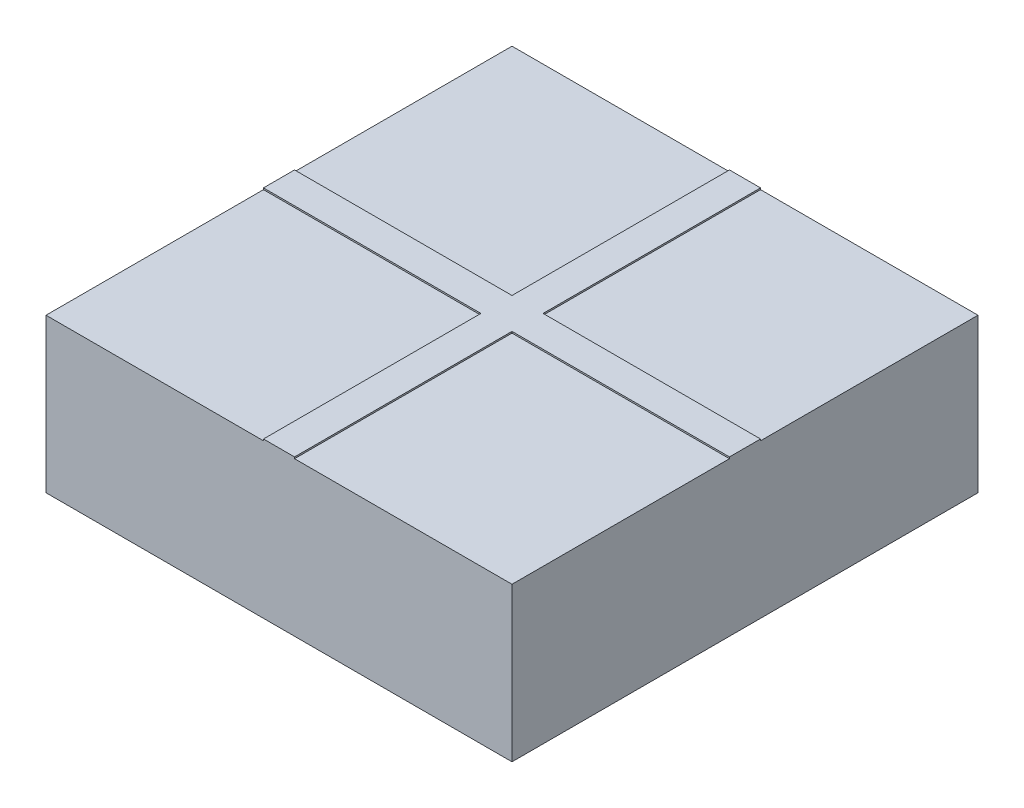
ISO-10303-21;
HEADER;
FILE_DESCRIPTION(('STEP AP214'),'2;1');
FILE_NAME('part.step','',(''),(''),'','','');
FILE_SCHEMA(('AUTOMOTIVE_DESIGN { 1 0 10303 214 1 1 1 1 }'));
ENDSEC;
DATA;
#1=APPLICATION_CONTEXT('core data for automotive mechanical design processes');
#2=APPLICATION_PROTOCOL_DEFINITION('international standard','automotive_design',2000,#1);
#3=PRODUCT_CONTEXT('',#1,'mechanical');
#4=PRODUCT('Part','Part','',(#3));
#5=PRODUCT_RELATED_PRODUCT_CATEGORY('part','',(#4));
#6=PRODUCT_DEFINITION_FORMATION('','',#4);
#7=PRODUCT_DEFINITION_CONTEXT('part definition',#1,'design');
#8=PRODUCT_DEFINITION('design','',#6,#7);
#9=PRODUCT_DEFINITION_SHAPE('','',#8);
#10=(LENGTH_UNIT() NAMED_UNIT(*) SI_UNIT(.MILLI.,.METRE.));
#11=(NAMED_UNIT(*) PLANE_ANGLE_UNIT() SI_UNIT($,.RADIAN.));
#12=(NAMED_UNIT(*) SI_UNIT($,.STERADIAN.) SOLID_ANGLE_UNIT());
#13=UNCERTAINTY_MEASURE_WITH_UNIT(LENGTH_MEASURE(1.E-05),#10,'distance_accuracy_value','');
#14=(GEOMETRIC_REPRESENTATION_CONTEXT(3) GLOBAL_UNCERTAINTY_ASSIGNED_CONTEXT((#13)) GLOBAL_UNIT_ASSIGNED_CONTEXT((#10,
#11,#12)) REPRESENTATION_CONTEXT('',''));
#15=CARTESIAN_POINT('',(0.,0.,0.));
#16=DIRECTION('',(0.,0.,1.));
#17=DIRECTION('',(1.,0.,0.));
#18=AXIS2_PLACEMENT_3D('',#15,#16,#17);
#19=CARTESIAN_POINT('',(150.,90.,150.));
#20=DIRECTION('',(-1.,0.,0.));
#21=DIRECTION('',(0.,0.,1.));
#22=AXIS2_PLACEMENT_3D('',#19,#20,#21);
#23=PLANE('',#22);
#24=DIRECTION('',(0.,-1.,0.));
#25=VECTOR('',#24,1.);
#26=CARTESIAN_POINT('',(150.,90.,-150.));
#27=LINE('',#26,#25);
#28=CARTESIAN_POINT('',(150.,99.,-150.));
#29=VERTEX_POINT('',#28);
#30=CARTESIAN_POINT('',(150.,0.,-150.));
#31=VERTEX_POINT('',#30);
#32=EDGE_CURVE('E12',#29,#31,#27,.T.);
#33=ORIENTED_EDGE('',*,*,#32,.F.);
#34=DIRECTION('',(0.,0.,-1.));
#35=VECTOR('',#34,1.);
#36=CARTESIAN_POINT('',(150.,99.,-10.));
#37=LINE('',#36,#35);
#38=CARTESIAN_POINT('',(150.,99.,-10.));
#39=VERTEX_POINT('',#38);
#40=EDGE_CURVE('E246',#39,#29,#37,.T.);
#41=ORIENTED_EDGE('',*,*,#40,.F.);
#42=DIRECTION('',(0.,-1.,0.));
#43=VECTOR('',#42,1.);
#44=CARTESIAN_POINT('',(150.,100.,-10.));
#45=LINE('',#44,#43);
#46=CARTESIAN_POINT('',(150.,100.,-10.));
#47=VERTEX_POINT('',#46);
#48=EDGE_CURVE('E272',#47,#39,#45,.T.);
#49=ORIENTED_EDGE('',*,*,#48,.F.);
#50=DIRECTION('',(0.,0.,-1.));
#51=VECTOR('',#50,1.);
#52=CARTESIAN_POINT('',(150.,100.,10.));
#53=LINE('',#52,#51);
#54=CARTESIAN_POINT('',(150.,100.,10.));
#55=VERTEX_POINT('',#54);
#56=EDGE_CURVE('E267',#55,#47,#53,.T.);
#57=ORIENTED_EDGE('',*,*,#56,.F.);
#58=DIRECTION('',(0.,-1.,0.));
#59=VECTOR('',#58,1.);
#60=CARTESIAN_POINT('',(150.,100.,10.));
#61=LINE('',#60,#59);
#62=CARTESIAN_POINT('',(150.,99.,10.));
#63=VERTEX_POINT('',#62);
#64=EDGE_CURVE('E236',#55,#63,#61,.T.);
#65=ORIENTED_EDGE('',*,*,#64,.T.);
#66=DIRECTION('',(0.,0.,-1.));
#67=VECTOR('',#66,1.);
#68=CARTESIAN_POINT('',(150.,99.,150.));
#69=LINE('',#68,#67);
#70=CARTESIAN_POINT('',(150.,99.,150.));
#71=VERTEX_POINT('',#70);
#72=EDGE_CURVE('E233',#71,#63,#69,.T.);
#73=ORIENTED_EDGE('',*,*,#72,.F.);
#74=DIRECTION('',(0.,-1.,0.));
#75=VECTOR('',#74,1.);
#76=CARTESIAN_POINT('',(150.,90.,150.));
#77=LINE('',#76,#75);
#78=CARTESIAN_POINT('',(150.,0.,150.));
#79=VERTEX_POINT('',#78);
#80=EDGE_CURVE('E211',#71,#79,#77,.T.);
#81=ORIENTED_EDGE('',*,*,#80,.T.);
#82=DIRECTION('',(0.,0.,-1.));
#83=VECTOR('',#82,1.);
#84=CARTESIAN_POINT('',(150.,0.,150.));
#85=LINE('',#84,#83);
#86=EDGE_CURVE('E202',#79,#31,#85,.T.);
#87=ORIENTED_EDGE('',*,*,#86,.T.);
#88=EDGE_LOOP('',(#33,#41,#49,#57,#65,#73,#81,#87));
#89=FACE_BOUND('',#88,.T.);
#90=ADVANCED_FACE('F61',(#89),#23,.F.);
#91=CARTESIAN_POINT('',(-150.,90.,-150.));
#92=DIRECTION('',(0.,0.,1.));
#93=DIRECTION('',(1.,0.,0.));
#94=AXIS2_PLACEMENT_3D('',#91,#92,#93);
#95=PLANE('',#94);
#96=DIRECTION('',(0.,-1.,0.));
#97=VECTOR('',#96,1.);
#98=CARTESIAN_POINT('',(-150.,90.,-150.));
#99=LINE('',#98,#97);
#100=CARTESIAN_POINT('',(-150.,99.,-150.));
#101=VERTEX_POINT('',#100);
#102=CARTESIAN_POINT('',(-150.,0.,-150.));
#103=VERTEX_POINT('',#102);
#104=EDGE_CURVE('E68',#101,#103,#99,.T.);
#105=ORIENTED_EDGE('',*,*,#104,.F.);
#106=DIRECTION('',(-1.,0.,0.));
#107=VECTOR('',#106,1.);
#108=CARTESIAN_POINT('',(-10.,99.,-150.));
#109=LINE('',#108,#107);
#110=CARTESIAN_POINT('',(-10.,99.,-150.));
#111=VERTEX_POINT('',#110);
#112=EDGE_CURVE('E188',#111,#101,#109,.T.);
#113=ORIENTED_EDGE('',*,*,#112,.F.);
#114=DIRECTION('',(0.,-1.,0.));
#115=VECTOR('',#114,1.);
#116=CARTESIAN_POINT('',(-10.,100.,-150.));
#117=LINE('',#116,#115);
#118=CARTESIAN_POINT('',(-10.,100.,-150.));
#119=VERTEX_POINT('',#118);
#120=EDGE_CURVE('E187',#119,#111,#117,.T.);
#121=ORIENTED_EDGE('',*,*,#120,.F.);
#122=DIRECTION('',(-1.,0.,0.));
#123=VECTOR('',#122,1.);
#124=CARTESIAN_POINT('',(10.,100.,-150.));
#125=LINE('',#124,#123);
#126=CARTESIAN_POINT('',(10.,100.,-150.));
#127=VERTEX_POINT('',#126);
#128=EDGE_CURVE('E276',#127,#119,#125,.T.);
#129=ORIENTED_EDGE('',*,*,#128,.F.);
#130=DIRECTION('',(0.,-1.,0.));
#131=VECTOR('',#130,1.);
#132=CARTESIAN_POINT('',(10.,100.,-150.));
#133=LINE('',#132,#131);
#134=CARTESIAN_POINT('',(10.,99.,-150.));
#135=VERTEX_POINT('',#134);
#136=EDGE_CURVE('E285',#127,#135,#133,.T.);
#137=ORIENTED_EDGE('',*,*,#136,.T.);
#138=DIRECTION('',(-1.,0.,0.));
#139=VECTOR('',#138,1.);
#140=CARTESIAN_POINT('',(150.,99.,-150.));
#141=LINE('',#140,#139);
#142=EDGE_CURVE('E317',#29,#135,#141,.T.);
#143=ORIENTED_EDGE('',*,*,#142,.F.);
#144=ORIENTED_EDGE('',*,*,#32,.T.);
#145=DIRECTION('',(-1.,0.,0.));
#146=VECTOR('',#145,1.);
#147=CARTESIAN_POINT('',(-150.,0.,-150.));
#148=LINE('',#147,#146);
#149=EDGE_CURVE('E205',#31,#103,#148,.T.);
#150=ORIENTED_EDGE('',*,*,#149,.T.);
#151=EDGE_LOOP('',(#105,#113,#121,#129,#137,#143,#144,#150));
#152=FACE_BOUND('',#151,.T.);
#153=ADVANCED_FACE('F318',(#152),#95,.F.);
#154=CARTESIAN_POINT('',(-150.,90.,150.));
#155=DIRECTION('',(1.,0.,0.));
#156=DIRECTION('',(0.,0.,-1.));
#157=AXIS2_PLACEMENT_3D('',#154,#155,#156);
#158=PLANE('',#157);
#159=DIRECTION('',(0.,-1.,0.));
#160=VECTOR('',#159,1.);
#161=CARTESIAN_POINT('',(-150.,90.,150.));
#162=LINE('',#161,#160);
#163=CARTESIAN_POINT('',(-150.,99.,150.));
#164=VERTEX_POINT('',#163);
#165=CARTESIAN_POINT('',(-150.,0.,150.));
#166=VERTEX_POINT('',#165);
#167=EDGE_CURVE('E214',#164,#166,#162,.T.);
#168=ORIENTED_EDGE('',*,*,#167,.F.);
#169=DIRECTION('',(0.,0.,1.));
#170=VECTOR('',#169,1.);
#171=CARTESIAN_POINT('',(-150.,99.,10.));
#172=LINE('',#171,#170);
#173=CARTESIAN_POINT('',(-150.,99.,10.));
#174=VERTEX_POINT('',#173);
#175=EDGE_CURVE('E255',#174,#164,#172,.T.);
#176=ORIENTED_EDGE('',*,*,#175,.F.);
#177=DIRECTION('',(0.,-1.,0.));
#178=VECTOR('',#177,1.);
#179=CARTESIAN_POINT('',(-150.,100.,10.));
#180=LINE('',#179,#178);
#181=CARTESIAN_POINT('',(-150.,100.,10.));
#182=VERTEX_POINT('',#181);
#183=EDGE_CURVE('E304',#182,#174,#180,.T.);
#184=ORIENTED_EDGE('',*,*,#183,.F.);
#185=DIRECTION('',(0.,0.,-1.));
#186=VECTOR('',#185,1.);
#187=CARTESIAN_POINT('',(-150.,100.,10.));
#188=LINE('',#187,#186);
#189=CARTESIAN_POINT('',(-150.,100.,-10.));
#190=VERTEX_POINT('',#189);
#191=EDGE_CURVE('E296',#182,#190,#188,.T.);
#192=ORIENTED_EDGE('',*,*,#191,.T.);
#193=DIRECTION('',(0.,-1.,0.));
#194=VECTOR('',#193,1.);
#195=CARTESIAN_POINT('',(-150.,100.,-10.));
#196=LINE('',#195,#194);
#197=CARTESIAN_POINT('',(-150.,99.,-10.));
#198=VERTEX_POINT('',#197);
#199=EDGE_CURVE('E306',#190,#198,#196,.T.);
#200=ORIENTED_EDGE('',*,*,#199,.T.);
#201=DIRECTION('',(0.,0.,1.));
#202=VECTOR('',#201,1.);
#203=CARTESIAN_POINT('',(-150.,99.,-150.));
#204=LINE('',#203,#202);
#205=EDGE_CURVE('E75',#101,#198,#204,.T.);
#206=ORIENTED_EDGE('',*,*,#205,.F.);
#207=ORIENTED_EDGE('',*,*,#104,.T.);
#208=DIRECTION('',(0.,0.,1.));
#209=VECTOR('',#208,1.);
#210=CARTESIAN_POINT('',(-150.,0.,150.));
#211=LINE('',#210,#209);
#212=EDGE_CURVE('E207',#103,#166,#211,.T.);
#213=ORIENTED_EDGE('',*,*,#212,.T.);
#214=EDGE_LOOP('',(#168,#176,#184,#192,#200,#206,#207,#213));
#215=FACE_BOUND('',#214,.T.);
#216=ADVANCED_FACE('F219',(#215),#158,.F.);
#217=CARTESIAN_POINT('',(-150.,90.,150.));
#218=DIRECTION('',(0.,0.,-1.));
#219=DIRECTION('',(-1.,0.,0.));
#220=AXIS2_PLACEMENT_3D('',#217,#218,#219);
#221=PLANE('',#220);
#222=ORIENTED_EDGE('',*,*,#80,.F.);
#223=DIRECTION('',(1.,0.,0.));
#224=VECTOR('',#223,1.);
#225=CARTESIAN_POINT('',(10.,99.,150.));
#226=LINE('',#225,#224);
#227=CARTESIAN_POINT('',(10.,99.,150.));
#228=VERTEX_POINT('',#227);
#229=EDGE_CURVE('E240',#228,#71,#226,.T.);
#230=ORIENTED_EDGE('',*,*,#229,.F.);
#231=DIRECTION('',(0.,-1.,0.));
#232=VECTOR('',#231,1.);
#233=CARTESIAN_POINT('',(10.,100.,150.));
#234=LINE('',#233,#232);
#235=CARTESIAN_POINT('',(10.,100.,150.));
#236=VERTEX_POINT('',#235);
#237=EDGE_CURVE('E198',#236,#228,#234,.T.);
#238=ORIENTED_EDGE('',*,*,#237,.F.);
#239=DIRECTION('',(-1.,0.,0.));
#240=VECTOR('',#239,1.);
#241=CARTESIAN_POINT('',(10.,100.,150.));
#242=LINE('',#241,#240);
#243=CARTESIAN_POINT('',(-10.,100.,150.));
#244=VERTEX_POINT('',#243);
#245=EDGE_CURVE('E268',#236,#244,#242,.T.);
#246=ORIENTED_EDGE('',*,*,#245,.T.);
#247=DIRECTION('',(0.,-1.,0.));
#248=VECTOR('',#247,1.);
#249=CARTESIAN_POINT('',(-10.,100.,150.));
#250=LINE('',#249,#248);
#251=CARTESIAN_POINT('',(-10.,99.,150.));
#252=VERTEX_POINT('',#251);
#253=EDGE_CURVE('E283',#244,#252,#250,.T.);
#254=ORIENTED_EDGE('',*,*,#253,.T.);
#255=DIRECTION('',(1.,0.,0.));
#256=VECTOR('',#255,1.);
#257=CARTESIAN_POINT('',(-150.,99.,150.));
#258=LINE('',#257,#256);
#259=EDGE_CURVE('E258',#164,#252,#258,.T.);
#260=ORIENTED_EDGE('',*,*,#259,.F.);
#261=ORIENTED_EDGE('',*,*,#167,.T.);
#262=DIRECTION('',(1.,0.,0.));
#263=VECTOR('',#262,1.);
#264=CARTESIAN_POINT('',(-150.,0.,150.));
#265=LINE('',#264,#263);
#266=EDGE_CURVE('E209',#166,#79,#265,.T.);
#267=ORIENTED_EDGE('',*,*,#266,.T.);
#268=EDGE_LOOP('',(#222,#230,#238,#246,#254,#260,#261,#267));
#269=FACE_BOUND('',#268,.T.);
#270=ADVANCED_FACE('F226',(#269),#221,.F.);
#271=CARTESIAN_POINT('',(0.,0.,0.));
#272=DIRECTION('',(0.,-1.,0.));
#273=DIRECTION('',(0.,0.,-1.));
#274=AXIS2_PLACEMENT_3D('',#271,#272,#273);
#275=PLANE('',#274);
#276=ORIENTED_EDGE('',*,*,#86,.F.);
#277=ORIENTED_EDGE('',*,*,#266,.F.);
#278=ORIENTED_EDGE('',*,*,#212,.F.);
#279=ORIENTED_EDGE('',*,*,#149,.F.);
#280=EDGE_LOOP('',(#276,#277,#278,#279));
#281=FACE_BOUND('',#280,.T.);
#282=ADVANCED_FACE('F224',(#281),#275,.T.);
#283=CARTESIAN_POINT('',(-10.,100.,150.));
#284=DIRECTION('',(-1.,0.,0.));
#285=DIRECTION('',(0.,0.,1.));
#286=AXIS2_PLACEMENT_3D('',#283,#284,#285);
#287=PLANE('',#286);
#288=DIRECTION('',(0.,0.,-1.));
#289=VECTOR('',#288,1.);
#290=CARTESIAN_POINT('',(-10.,99.,150.));
#291=LINE('',#290,#289);
#292=CARTESIAN_POINT('',(-10.,99.,10.));
#293=VERTEX_POINT('',#292);
#294=EDGE_CURVE('E261',#252,#293,#291,.T.);
#295=ORIENTED_EDGE('',*,*,#294,.F.);
#296=ORIENTED_EDGE('',*,*,#253,.F.);
#297=DIRECTION('',(0.,0.,-1.));
#298=VECTOR('',#297,1.);
#299=CARTESIAN_POINT('',(-10.,100.,150.));
#300=LINE('',#299,#298);
#301=CARTESIAN_POINT('',(-10.,100.,10.));
#302=VERTEX_POINT('',#301);
#303=EDGE_CURVE('E273',#244,#302,#300,.T.);
#304=ORIENTED_EDGE('',*,*,#303,.T.);
#305=DIRECTION('',(0.,1.,0.));
#306=VECTOR('',#305,1.);
#307=CARTESIAN_POINT('',(-10.,100.,10.));
#308=LINE('',#307,#306);
#309=EDGE_CURVE('E194',#293,#302,#308,.T.);
#310=ORIENTED_EDGE('',*,*,#309,.F.);
#311=EDGE_LOOP('',(#295,#296,#304,#310));
#312=FACE_BOUND('',#311,.T.);
#313=ADVANCED_FACE('F340',(#312),#287,.T.);
#314=CARTESIAN_POINT('',(10.,100.,150.));
#315=DIRECTION('',(-1.,0.,0.));
#316=DIRECTION('',(0.,0.,1.));
#317=AXIS2_PLACEMENT_3D('',#314,#315,#316);
#318=PLANE('',#317);
#319=ORIENTED_EDGE('',*,*,#237,.T.);
#320=DIRECTION('',(0.,0.,1.));
#321=VECTOR('',#320,1.);
#322=CARTESIAN_POINT('',(10.,99.,10.));
#323=LINE('',#322,#321);
#324=CARTESIAN_POINT('',(10.,99.,10.));
#325=VERTEX_POINT('',#324);
#326=EDGE_CURVE('E245',#325,#228,#323,.T.);
#327=ORIENTED_EDGE('',*,*,#326,.F.);
#328=DIRECTION('',(0.,1.,0.));
#329=VECTOR('',#328,1.);
#330=CARTESIAN_POINT('',(10.,100.,10.));
#331=LINE('',#330,#329);
#332=CARTESIAN_POINT('',(10.,100.,10.));
#333=VERTEX_POINT('',#332);
#334=EDGE_CURVE('E193',#325,#333,#331,.T.);
#335=ORIENTED_EDGE('',*,*,#334,.T.);
#336=DIRECTION('',(0.,0.,-1.));
#337=VECTOR('',#336,1.);
#338=CARTESIAN_POINT('',(10.,100.,150.));
#339=LINE('',#338,#337);
#340=EDGE_CURVE('E280',#236,#333,#339,.T.);
#341=ORIENTED_EDGE('',*,*,#340,.F.);
#342=EDGE_LOOP('',(#319,#327,#335,#341));
#343=FACE_BOUND('',#342,.T.);
#344=ADVANCED_FACE('F332',(#343),#318,.F.);
#345=CARTESIAN_POINT('',(0.,100.,0.));
#346=DIRECTION('',(0.,-1.,0.));
#347=DIRECTION('',(0.,0.,-1.));
#348=AXIS2_PLACEMENT_3D('',#345,#346,#347);
#349=PLANE('',#348);
#350=ORIENTED_EDGE('',*,*,#340,.T.);
#351=DIRECTION('',(-1.,0.,0.));
#352=VECTOR('',#351,1.);
#353=CARTESIAN_POINT('',(150.,100.,10.));
#354=LINE('',#353,#352);
#355=EDGE_CURVE('E300',#55,#333,#354,.T.);
#356=ORIENTED_EDGE('',*,*,#355,.F.);
#357=ORIENTED_EDGE('',*,*,#56,.T.);
#358=DIRECTION('',(-1.,0.,0.));
#359=VECTOR('',#358,1.);
#360=CARTESIAN_POINT('',(150.,100.,-10.));
#361=LINE('',#360,#359);
#362=CARTESIAN_POINT('',(10.,100.,-10.));
#363=VERTEX_POINT('',#362);
#364=EDGE_CURVE('E293',#47,#363,#361,.T.);
#365=ORIENTED_EDGE('',*,*,#364,.T.);
#366=EDGE_CURVE('E279',#363,#127,#339,.T.);
#367=ORIENTED_EDGE('',*,*,#366,.T.);
#368=ORIENTED_EDGE('',*,*,#128,.T.);
#369=CARTESIAN_POINT('',(-10.,100.,-10.));
#370=VERTEX_POINT('',#369);
#371=EDGE_CURVE('E271',#370,#119,#300,.T.);
#372=ORIENTED_EDGE('',*,*,#371,.F.);
#373=EDGE_CURVE('E191',#370,#190,#361,.T.);
#374=ORIENTED_EDGE('',*,*,#373,.T.);
#375=ORIENTED_EDGE('',*,*,#191,.F.);
#376=EDGE_CURVE('E299',#302,#182,#354,.T.);
#377=ORIENTED_EDGE('',*,*,#376,.F.);
#378=ORIENTED_EDGE('',*,*,#303,.F.);
#379=ORIENTED_EDGE('',*,*,#245,.F.);
#380=EDGE_LOOP('',(#350,#356,#357,#365,#367,#368,#372,#374,#375,#377,#378,#379));
#381=FACE_BOUND('',#380,.T.);
#382=ADVANCED_FACE('F326',(#381),#349,.F.);
#383=DIRECTION('',(0.,0.,-1.));
#384=VECTOR('',#383,1.);
#385=CARTESIAN_POINT('',(-10.,99.,-10.));
#386=LINE('',#385,#384);
#387=CARTESIAN_POINT('',(-10.,99.,-10.));
#388=VERTEX_POINT('',#387);
#389=EDGE_CURVE('E174',#388,#111,#386,.T.);
#390=ORIENTED_EDGE('',*,*,#389,.F.);
#391=DIRECTION('',(0.,1.,0.));
#392=VECTOR('',#391,1.);
#393=CARTESIAN_POINT('',(-10.,100.,-10.));
#394=LINE('',#393,#392);
#395=EDGE_CURVE('E184',#388,#370,#394,.T.);
#396=ORIENTED_EDGE('',*,*,#395,.T.);
#397=ORIENTED_EDGE('',*,*,#371,.T.);
#398=ORIENTED_EDGE('',*,*,#120,.T.);
#399=EDGE_LOOP('',(#390,#396,#397,#398));
#400=FACE_BOUND('',#399,.T.);
#401=ADVANCED_FACE('F183',(#400),#287,.T.);
#402=DIRECTION('',(0.,1.,0.));
#403=VECTOR('',#402,1.);
#404=CARTESIAN_POINT('',(10.,100.,-10.));
#405=LINE('',#404,#403);
#406=CARTESIAN_POINT('',(10.,99.,-10.));
#407=VERTEX_POINT('',#406);
#408=EDGE_CURVE('E196',#407,#363,#405,.T.);
#409=ORIENTED_EDGE('',*,*,#408,.F.);
#410=DIRECTION('',(0.,0.,1.));
#411=VECTOR('',#410,1.);
#412=CARTESIAN_POINT('',(10.,99.,-150.));
#413=LINE('',#412,#411);
#414=EDGE_CURVE('E83',#135,#407,#413,.T.);
#415=ORIENTED_EDGE('',*,*,#414,.F.);
#416=ORIENTED_EDGE('',*,*,#136,.F.);
#417=ORIENTED_EDGE('',*,*,#366,.F.);
#418=EDGE_LOOP('',(#409,#415,#416,#417));
#419=FACE_BOUND('',#418,.T.);
#420=ADVANCED_FACE('F329',(#419),#318,.F.);
#421=CARTESIAN_POINT('',(150.,100.,-10.));
#422=DIRECTION('',(0.,0.,1.));
#423=DIRECTION('',(1.,0.,0.));
#424=AXIS2_PLACEMENT_3D('',#421,#422,#423);
#425=PLANE('',#424);
#426=ORIENTED_EDGE('',*,*,#395,.F.);
#427=DIRECTION('',(1.,0.,0.));
#428=VECTOR('',#427,1.);
#429=CARTESIAN_POINT('',(-150.,99.,-10.));
#430=LINE('',#429,#428);
#431=EDGE_CURVE('E171',#198,#388,#430,.T.);
#432=ORIENTED_EDGE('',*,*,#431,.F.);
#433=ORIENTED_EDGE('',*,*,#199,.F.);
#434=ORIENTED_EDGE('',*,*,#373,.F.);
#435=EDGE_LOOP('',(#426,#432,#433,#434));
#436=FACE_BOUND('',#435,.T.);
#437=ADVANCED_FACE('F190',(#436),#425,.F.);
#438=CARTESIAN_POINT('',(150.,100.,10.));
#439=DIRECTION('',(0.,0.,1.));
#440=DIRECTION('',(1.,0.,0.));
#441=AXIS2_PLACEMENT_3D('',#438,#439,#440);
#442=PLANE('',#441);
#443=DIRECTION('',(-1.,0.,0.));
#444=VECTOR('',#443,1.);
#445=CARTESIAN_POINT('',(-10.,99.,10.));
#446=LINE('',#445,#444);
#447=EDGE_CURVE('E264',#293,#174,#446,.T.);
#448=ORIENTED_EDGE('',*,*,#447,.F.);
#449=ORIENTED_EDGE('',*,*,#309,.T.);
#450=ORIENTED_EDGE('',*,*,#376,.T.);
#451=ORIENTED_EDGE('',*,*,#183,.T.);
#452=EDGE_LOOP('',(#448,#449,#450,#451));
#453=FACE_BOUND('',#452,.T.);
#454=ADVANCED_FACE('F337',(#453),#442,.T.);
#455=ORIENTED_EDGE('',*,*,#48,.T.);
#456=DIRECTION('',(1.,0.,0.));
#457=VECTOR('',#456,1.);
#458=CARTESIAN_POINT('',(10.,99.,-10.));
#459=LINE('',#458,#457);
#460=EDGE_CURVE('E249',#407,#39,#459,.T.);
#461=ORIENTED_EDGE('',*,*,#460,.F.);
#462=ORIENTED_EDGE('',*,*,#408,.T.);
#463=ORIENTED_EDGE('',*,*,#364,.F.);
#464=EDGE_LOOP('',(#455,#461,#462,#463));
#465=FACE_BOUND('',#464,.T.);
#466=ADVANCED_FACE('F311',(#465),#425,.F.);
#467=DIRECTION('',(-1.,0.,0.));
#468=VECTOR('',#467,1.);
#469=CARTESIAN_POINT('',(150.,99.,10.));
#470=LINE('',#469,#468);
#471=EDGE_CURVE('E239',#63,#325,#470,.T.);
#472=ORIENTED_EDGE('',*,*,#471,.F.);
#473=ORIENTED_EDGE('',*,*,#64,.F.);
#474=ORIENTED_EDGE('',*,*,#355,.T.);
#475=ORIENTED_EDGE('',*,*,#334,.F.);
#476=EDGE_LOOP('',(#472,#473,#474,#475));
#477=FACE_BOUND('',#476,.T.);
#478=ADVANCED_FACE('F359',(#477),#442,.T.);
#479=CARTESIAN_POINT('',(0.,99.,0.));
#480=DIRECTION('',(0.,1.,0.));
#481=DIRECTION('',(0.,0.,1.));
#482=AXIS2_PLACEMENT_3D('',#479,#480,#481);
#483=PLANE('',#482);
#484=ORIENTED_EDGE('',*,*,#175,.T.);
#485=ORIENTED_EDGE('',*,*,#259,.T.);
#486=ORIENTED_EDGE('',*,*,#294,.T.);
#487=ORIENTED_EDGE('',*,*,#447,.T.);
#488=EDGE_LOOP('',(#484,#485,#486,#487));
#489=FACE_BOUND('',#488,.T.);
#490=ADVANCED_FACE('F368',(#489),#483,.T.);
#491=CARTESIAN_POINT('',(0.,99.,0.));
#492=DIRECTION('',(0.,1.,0.));
#493=DIRECTION('',(0.,0.,1.));
#494=AXIS2_PLACEMENT_3D('',#491,#492,#493);
#495=PLANE('',#494);
#496=ORIENTED_EDGE('',*,*,#229,.T.);
#497=ORIENTED_EDGE('',*,*,#72,.T.);
#498=ORIENTED_EDGE('',*,*,#471,.T.);
#499=ORIENTED_EDGE('',*,*,#326,.T.);
#500=EDGE_LOOP('',(#496,#497,#498,#499));
#501=FACE_BOUND('',#500,.T.);
#502=ADVANCED_FACE('F243',(#501),#495,.T.);
#503=CARTESIAN_POINT('',(0.,99.,0.));
#504=DIRECTION('',(0.,1.,0.));
#505=DIRECTION('',(0.,0.,1.));
#506=AXIS2_PLACEMENT_3D('',#503,#504,#505);
#507=PLANE('',#506);
#508=ORIENTED_EDGE('',*,*,#142,.T.);
#509=ORIENTED_EDGE('',*,*,#414,.T.);
#510=ORIENTED_EDGE('',*,*,#460,.T.);
#511=ORIENTED_EDGE('',*,*,#40,.T.);
#512=EDGE_LOOP('',(#508,#509,#510,#511));
#513=FACE_BOUND('',#512,.T.);
#514=ADVANCED_FACE('F316',(#513),#507,.T.);
#515=CARTESIAN_POINT('',(0.,99.,0.));
#516=DIRECTION('',(0.,1.,0.));
#517=DIRECTION('',(0.,0.,1.));
#518=AXIS2_PLACEMENT_3D('',#515,#516,#517);
#519=PLANE('',#518);
#520=ORIENTED_EDGE('',*,*,#205,.T.);
#521=ORIENTED_EDGE('',*,*,#431,.T.);
#522=ORIENTED_EDGE('',*,*,#389,.T.);
#523=ORIENTED_EDGE('',*,*,#112,.T.);
#524=EDGE_LOOP('',(#520,#521,#522,#523));
#525=FACE_BOUND('',#524,.T.);
#526=ADVANCED_FACE('F173',(#525),#519,.T.);
#527=CLOSED_SHELL('',(#90,#153,#216,#270,#282,#313,#344,#382,#401,#420,#437,#454,#466,#478,#490,
#502,#514,#526));
#528=MANIFOLD_SOLID_BREP('B2',#527);
#529=ADVANCED_BREP_SHAPE_REPRESENTATION('',(#18,#528),#14);
#530=SHAPE_DEFINITION_REPRESENTATION(#9,#529);
ENDSEC;
END-ISO-10303-21;
